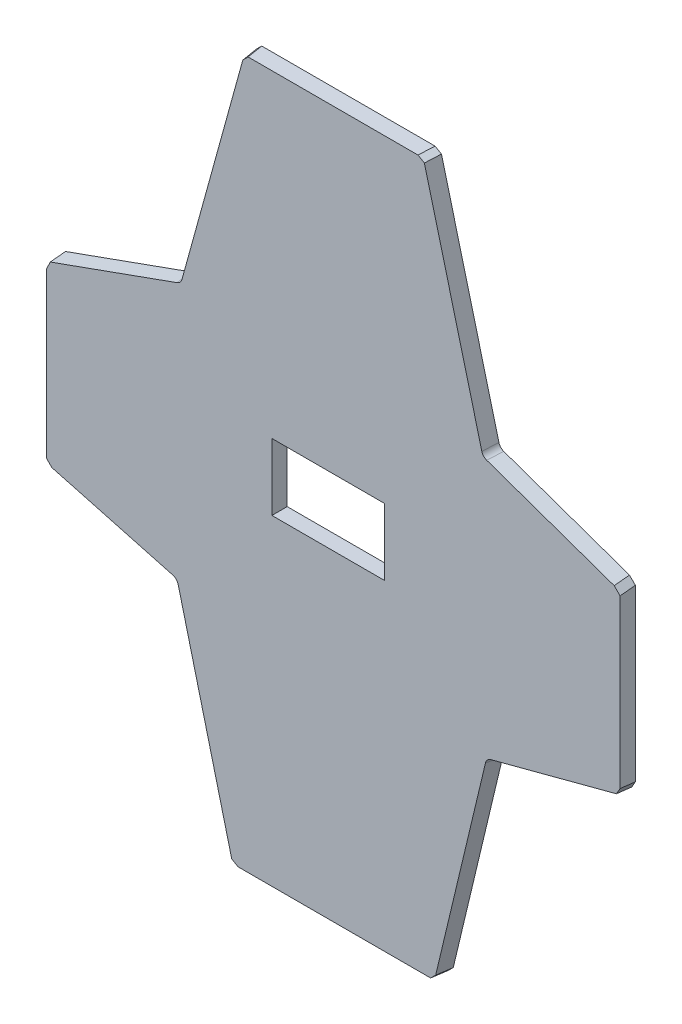
ISO-10303-21;
HEADER;
FILE_DESCRIPTION(('STEP AP214'),'2;1');
FILE_NAME('part.step','',(''),(''),'','','');
FILE_SCHEMA(('AUTOMOTIVE_DESIGN { 1 0 10303 214 1 1 1 1 }'));
ENDSEC;
DATA;
#1=APPLICATION_CONTEXT('core data for automotive mechanical design processes');
#2=APPLICATION_PROTOCOL_DEFINITION('international standard','automotive_design',2000,#1);
#3=PRODUCT_CONTEXT('',#1,'mechanical');
#4=PRODUCT('Part','Part','',(#3));
#5=PRODUCT_RELATED_PRODUCT_CATEGORY('part','',(#4));
#6=PRODUCT_DEFINITION_FORMATION('','',#4);
#7=PRODUCT_DEFINITION_CONTEXT('part definition',#1,'design');
#8=PRODUCT_DEFINITION('design','',#6,#7);
#9=PRODUCT_DEFINITION_SHAPE('','',#8);
#10=(LENGTH_UNIT() NAMED_UNIT(*) SI_UNIT(.MILLI.,.METRE.));
#11=(NAMED_UNIT(*) PLANE_ANGLE_UNIT() SI_UNIT($,.RADIAN.));
#12=(NAMED_UNIT(*) SI_UNIT($,.STERADIAN.) SOLID_ANGLE_UNIT());
#13=UNCERTAINTY_MEASURE_WITH_UNIT(LENGTH_MEASURE(1.E-05),#10,'distance_accuracy_value','');
#14=(GEOMETRIC_REPRESENTATION_CONTEXT(3) GLOBAL_UNCERTAINTY_ASSIGNED_CONTEXT((#13)) GLOBAL_UNIT_ASSIGNED_CONTEXT((#10,
#11,#12)) REPRESENTATION_CONTEXT('',''));
#15=CARTESIAN_POINT('',(0.,0.,0.));
#16=DIRECTION('',(0.,0.,1.));
#17=DIRECTION('',(1.,0.,0.));
#18=AXIS2_PLACEMENT_3D('',#15,#16,#17);
#19=CARTESIAN_POINT('',(-36.5402535478192,31.6416875138179,-36.));
#20=DIRECTION('',(0.,0.,1.));
#21=DIRECTION('',(1.,0.,0.));
#22=AXIS2_PLACEMENT_3D('',#19,#20,#21);
#23=PLANE('',#22);
#24=DIRECTION('',(0.266042791283463,0.96396121976255,0.));
#25=VECTOR('',#24,1.);
#26=CARTESIAN_POINT('',(-40.3843388760392,32.8659643599515,-36.));
#27=LINE('',#26,#25);
#28=CARTESIAN_POINT('',(-23.6840092023886,93.376794534998,-36.));
#29=VERTEX_POINT('',#28);
#30=CARTESIAN_POINT('',(-39.6006537185788,35.705515458671,-36.));
#31=VERTEX_POINT('',#30);
#32=EDGE_CURVE('E414',#29,#31,#27,.F.);
#33=ORIENTED_EDGE('',*,*,#32,.T.);
#34=CARTESIAN_POINT('',(-41.5421698604185,36.2470950169221,-36.));
#35=DIRECTION('',(0.,0.,1.));
#36=DIRECTION('',(0.902518135770878,-0.430651848486291,0.));
#37=AXIS2_PLACEMENT_3D('',#34,#35,#36);
#38=ELLIPSE('',#37,2.01612154459738,2.);
#39=CARTESIAN_POINT('',(-40.8485815374249,34.362458478107,-36.));
#40=VERTEX_POINT('',#39);
#41=EDGE_CURVE('E426',#31,#40,#38,.F.);
#42=ORIENTED_EDGE('',*,*,#41,.T.);
#43=DIRECTION('',(0.94120658805755,0.337831553584126,0.));
#44=VECTOR('',#43,1.);
#45=CARTESIAN_POINT('',(-74.5742274919446,22.2571592664243,-36.));
#46=LINE('',#45,#44);
#47=CARTESIAN_POINT('',(-74.0583025109049,22.4423425620887,-36.));
#48=VERTEX_POINT('',#47);
#49=EDGE_CURVE('E407',#40,#48,#46,.F.);
#50=ORIENTED_EDGE('',*,*,#49,.T.);
#51=DIRECTION('',(0.426365012162787,0.904551201648324,0.));
#52=VECTOR('',#51,1.);
#53=CARTESIAN_POINT('',(-78.2799950445426,13.4858453229724,-36.));
#54=LINE('',#53,#52);
#55=CARTESIAN_POINT('',(-75.,20.4444919621315,-36.));
#56=VERTEX_POINT('',#55);
#57=EDGE_CURVE('E391',#56,#48,#54,.T.);
#58=ORIENTED_EDGE('',*,*,#57,.F.);
#59=DIRECTION('',(0.,-1.,0.));
#60=VECTOR('',#59,1.);
#61=CARTESIAN_POINT('',(-75.,-15.,-36.));
#62=LINE('',#61,#60);
#63=CARTESIAN_POINT('',(-75.,-22.5363153576917,-36.));
#64=VERTEX_POINT('',#63);
#65=EDGE_CURVE('E406',#56,#64,#62,.T.);
#66=ORIENTED_EDGE('',*,*,#65,.T.);
#67=DIRECTION('',(-0.704762476360892,0.7094433394667,0.));
#68=VECTOR('',#67,1.);
#69=CARTESIAN_POINT('',(-78.5214099784737,-18.9915170198748,-36.));
#70=LINE('',#69,#68);
#71=CARTESIAN_POINT('',(-73.634658758092,-23.9107248682157,-36.));
#72=VERTEX_POINT('',#71);
#73=EDGE_CURVE('E394',#72,#64,#70,.T.);
#74=ORIENTED_EDGE('',*,*,#73,.F.);
#75=DIRECTION('',(-0.965584527186857,0.260089447800818,0.));
#76=VECTOR('',#75,1.);
#77=CARTESIAN_POINT('',(-32.493377225832,-34.9925233998452,-36.));
#78=LINE('',#77,#76);
#79=CARTESIAN_POINT('',(-42.002974198056,-32.4310223031779,-36.));
#80=VERTEX_POINT('',#79);
#81=EDGE_CURVE('E397',#72,#80,#78,.F.);
#82=ORIENTED_EDGE('',*,*,#81,.T.);
#83=CARTESIAN_POINT('',(-42.5479793065294,-34.3683334038556,-36.));
#84=DIRECTION('',(0.,0.,1.));
#85=DIRECTION('',(0.841020093323564,0.541003884113621,0.));
#86=AXIS2_PLACEMENT_3D('',#83,#84,#85);
#87=ELLIPSE('',#86,2.02249647616795,2.);
#88=CARTESIAN_POINT('',(-40.5932409731802,-33.8578810221488,-36.));
#89=VERTEX_POINT('',#88);
#90=EDGE_CURVE('E253',#80,#89,#87,.F.);
#91=ORIENTED_EDGE('',*,*,#90,.T.);
#92=DIRECTION('',(-0.246202748440187,0.969218348289227,0.));
#93=VECTOR('',#92,1.);
#94=CARTESIAN_POINT('',(-25.9416393245706,-91.5363644656716,-36.));
#95=LINE('',#94,#93);
#96=CARTESIAN_POINT('',(-26.5782707306176,-89.0301583256217,-36.));
#97=VERTEX_POINT('',#96);
#98=EDGE_CURVE('E248',#89,#97,#95,.F.);
#99=ORIENTED_EDGE('',*,*,#98,.T.);
#100=DIRECTION('',(-0.860536730968405,0.509388392736045,0.));
#101=VECTOR('',#100,1.);
#102=CARTESIAN_POINT('',(-15.1391820554169,-95.8014427867373,-36.));
#103=LINE('',#102,#101);
#104=CARTESIAN_POINT('',(-24.9398659378746,-90.,-36.));
#105=VERTEX_POINT('',#104);
#106=EDGE_CURVE('E396',#105,#97,#103,.T.);
#107=ORIENTED_EDGE('',*,*,#106,.F.);
#108=DIRECTION('',(1.,0.,0.));
#109=VECTOR('',#108,1.);
#110=CARTESIAN_POINT('',(15.,-90.,-36.));
#111=LINE('',#110,#109);
#112=CARTESIAN_POINT('',(25.4397337159729,-90.,-36.));
#113=VERTEX_POINT('',#112);
#114=EDGE_CURVE('E418',#105,#113,#111,.T.);
#115=ORIENTED_EDGE('',*,*,#114,.T.);
#116=DIRECTION('',(-0.710962910168323,-0.703229507604017,0.));
#117=VECTOR('',#116,1.);
#118=CARTESIAN_POINT('',(20.4631774215762,-94.9224244787168,-36.));
#119=LINE('',#118,#117);
#120=CARTESIAN_POINT('',(26.7632939212635,-88.6908366412104,-36.));
#121=VERTEX_POINT('',#120);
#122=EDGE_CURVE('E249',#121,#113,#119,.T.);
#123=ORIENTED_EDGE('',*,*,#122,.F.);
#124=DIRECTION('',(-0.232223509792915,-0.972662449927754,0.));
#125=VECTOR('',#124,1.);
#126=CARTESIAN_POINT('',(41.1041337500767,-28.6245823056621,-36.));
#127=LINE('',#126,#125);
#128=CARTESIAN_POINT('',(39.795840619288,-34.104335854092,-36.));
#129=VERTEX_POINT('',#128);
#130=EDGE_CURVE('E235',#121,#129,#127,.F.);
#131=ORIENTED_EDGE('',*,*,#130,.T.);
#132=CARTESIAN_POINT('',(41.7579711394341,-34.5880220555358,-36.));
#133=DIRECTION('',(0.,0.,1.));
#134=DIRECTION('',(-0.837657940995873,0.546195179296335,0.));
#135=AXIS2_PLACEMENT_3D('',#132,#133,#134);
#136=ELLIPSE('',#135,2.02346057407456,2.);
#137=CARTESIAN_POINT('',(41.2212929928244,-32.6477918162582,-36.));
#138=VERTEX_POINT('',#137);
#139=EDGE_CURVE('E250',#129,#138,#136,.F.);
#140=ORIENTED_EDGE('',*,*,#139,.T.);
#141=DIRECTION('',(-0.966833104440869,-0.255408982138907,0.));
#142=VECTOR('',#141,1.);
#143=CARTESIAN_POINT('',(74.3866081874635,-23.8864871430204,-36.));
#144=LINE('',#143,#142);
#145=CARTESIAN_POINT('',(74.0327342795837,-23.9799702624978,-36.));
#146=VERTEX_POINT('',#145);
#147=EDGE_CURVE('E252',#138,#146,#144,.F.);
#148=ORIENTED_EDGE('',*,*,#147,.T.);
#149=DIRECTION('',(-0.501926972034819,-0.864910003840837,0.));
#150=VECTOR('',#149,1.);
#151=CARTESIAN_POINT('',(79.5633827357512,-14.4496731396439,-36.));
#152=LINE('',#151,#150);
#153=CARTESIAN_POINT('',(75.,-22.3131983124493,-36.));
#154=VERTEX_POINT('',#153);
#155=EDGE_CURVE('E389',#154,#146,#152,.T.);
#156=ORIENTED_EDGE('',*,*,#155,.F.);
#157=DIRECTION('',(0.,1.,0.));
#158=VECTOR('',#157,1.);
#159=CARTESIAN_POINT('',(75.,15.,-36.));
#160=LINE('',#159,#158);
#161=CARTESIAN_POINT('',(75.,21.3394243131476,-36.));
#162=VERTEX_POINT('',#161);
#163=EDGE_CURVE('E425',#154,#162,#160,.T.);
#164=ORIENTED_EDGE('',*,*,#163,.T.);
#165=DIRECTION('',(0.705371914071374,-0.708837402257588,0.));
#166=VECTOR('',#165,1.);
#167=CARTESIAN_POINT('',(77.6521292861005,18.6742651310079,-36.));
#168=LINE('',#167,#166);
#169=CARTESIAN_POINT('',(73.4608455350852,22.8861406351601,-36.));
#170=VERTEX_POINT('',#169);
#171=EDGE_CURVE('E384',#170,#162,#168,.T.);
#172=ORIENTED_EDGE('',*,*,#171,.F.);
#173=DIRECTION('',(0.943264607804052,-0.332041984791484,0.));
#174=VECTOR('',#173,1.);
#175=CARTESIAN_POINT('',(31.6779838024015,37.5942768518753,-36.));
#176=LINE('',#175,#174);
#177=CARTESIAN_POINT('',(40.1050450980807,34.6278365387049,-36.));
#178=VERTEX_POINT('',#177);
#179=EDGE_CURVE('E424',#170,#178,#176,.F.);
#180=ORIENTED_EDGE('',*,*,#179,.T.);
#181=CARTESIAN_POINT('',(40.7881302682312,36.5169480795651,-36.));
#182=DIRECTION('',(0.,0.,1.));
#183=DIRECTION('',(-0.896885715655142,-0.442262380328425,0.));
#184=AXIS2_PLACEMENT_3D('',#181,#182,#183);
#185=ELLIPSE('',#184,2.01707177083657,2.);
#186=CARTESIAN_POINT('',(38.8382898644863,36.0032008340004,-36.));
#187=VERTEX_POINT('',#186);
#188=EDGE_CURVE('E256',#178,#187,#185,.F.);
#189=ORIENTED_EDGE('',*,*,#188,.T.);
#190=DIRECTION('',(0.251551335305415,-0.967843957312367,0.));
#191=VECTOR('',#190,1.);
#192=CARTESIAN_POINT('',(24.7499132754801,90.2082406659524,-36.));
#193=LINE('',#192,#191);
#194=CARTESIAN_POINT('',(23.8153141315703,93.8041115956142,-36.));
#195=VERTEX_POINT('',#194);
#196=EDGE_CURVE('E420',#187,#195,#193,.F.);
#197=ORIENTED_EDGE('',*,*,#196,.T.);
#198=DIRECTION('',(-0.865228886840942,0.501377077034824,0.));
#199=VECTOR('',#198,1.);
#200=CARTESIAN_POINT('',(17.9798531385479,97.1856056954179,-36.));
#201=LINE('',#200,#199);
#202=CARTESIAN_POINT('',(22.1441897787212,94.7724836138583,-36.));
#203=VERTEX_POINT('',#202);
#204=EDGE_CURVE('E386',#203,#195,#201,.F.);
#205=ORIENTED_EDGE('',*,*,#204,.F.);
#206=DIRECTION('',(1.,0.,0.));
#207=VECTOR('',#206,1.);
#208=CARTESIAN_POINT('',(40.,94.7724836138583,-36.));
#209=LINE('',#208,#207);
#210=CARTESIAN_POINT('',(-22.2925713826402,94.7724836138583,-36.));
#211=VERTEX_POINT('',#210);
#212=EDGE_CURVE('E415',#203,#211,#209,.F.);
#213=ORIENTED_EDGE('',*,*,#212,.T.);
#214=DIRECTION('',(-0.706027396077023,-0.708184521144524,0.));
#215=VECTOR('',#214,1.);
#216=CARTESIAN_POINT('',(-21.6044927614201,95.4626645212652,-36.));
#217=LINE('',#216,#215);
#218=EDGE_CURVE('E393',#29,#211,#217,.F.);
#219=ORIENTED_EDGE('',*,*,#218,.F.);
#220=EDGE_LOOP('',(#33,#42,#50,#58,#66,#74,#82,#91,#99,#107,#115,#123,#131,#140,#148,#156,#164,
#172,#180,#189,#197,#205,#213,#219));
#221=FACE_BOUND('',#220,.T.);
#222=DIRECTION('',(1.,0.,0.));
#223=VECTOR('',#222,1.);
#224=CARTESIAN_POINT('',(13.3265107487808,11.4688759171328,-36.));
#225=LINE('',#224,#223);
#226=CARTESIAN_POINT('',(-16.0725796303478,11.4688759171328,-36.));
#227=VERTEX_POINT('',#226);
#228=CARTESIAN_POINT('',(13.3265107487808,11.4688759171328,-36.));
#229=VERTEX_POINT('',#228);
#230=EDGE_CURVE('E363',#227,#229,#225,.T.);
#231=ORIENTED_EDGE('',*,*,#230,.T.);
#232=DIRECTION('',(0.,-1.,0.));
#233=VECTOR('',#232,1.);
#234=CARTESIAN_POINT('',(13.3265107487808,11.4688759171328,-36.));
#235=LINE('',#234,#233);
#236=CARTESIAN_POINT('',(13.3265107487808,-5.97673815399842,-36.));
#237=VERTEX_POINT('',#236);
#238=EDGE_CURVE('E11',#229,#237,#235,.T.);
#239=ORIENTED_EDGE('',*,*,#238,.T.);
#240=DIRECTION('',(-1.,0.,0.));
#241=VECTOR('',#240,1.);
#242=CARTESIAN_POINT('',(13.3265107487808,-5.97673815399842,-36.));
#243=LINE('',#242,#241);
#244=CARTESIAN_POINT('',(-16.0725796303478,-5.97673815399842,-36.));
#245=VERTEX_POINT('',#244);
#246=EDGE_CURVE('E366',#237,#245,#243,.T.);
#247=ORIENTED_EDGE('',*,*,#246,.T.);
#248=DIRECTION('',(0.,1.,0.));
#249=VECTOR('',#248,1.);
#250=CARTESIAN_POINT('',(-16.0725796303478,11.4688759171328,-36.));
#251=LINE('',#250,#249);
#252=EDGE_CURVE('E368',#245,#227,#251,.T.);
#253=ORIENTED_EDGE('',*,*,#252,.T.);
#254=EDGE_LOOP('',(#231,#239,#247,#253));
#255=FACE_BOUND('',#254,.T.);
#256=ADVANCED_FACE('F37',(#221,#255),#23,.T.);
#257=CARTESIAN_POINT('',(13.3265107487808,11.4688759171328,50.001));
#258=DIRECTION('',(0.,1.,0.));
#259=DIRECTION('',(0.,0.,1.));
#260=AXIS2_PLACEMENT_3D('',#257,#258,#259);
#261=PLANE('',#260);
#262=DIRECTION('',(0.,0.,-1.));
#263=VECTOR('',#262,1.);
#264=CARTESIAN_POINT('',(-16.0725796303478,11.4688759171328,50.001));
#265=LINE('',#264,#263);
#266=CARTESIAN_POINT('',(-16.0725796303478,11.4688759171328,-40.));
#267=VERTEX_POINT('',#266);
#268=EDGE_CURVE('E64',#227,#267,#265,.T.);
#269=ORIENTED_EDGE('',*,*,#268,.T.);
#270=DIRECTION('',(1.,0.,0.));
#271=VECTOR('',#270,1.);
#272=CARTESIAN_POINT('',(13.3265107487808,11.4688759171328,-40.));
#273=LINE('',#272,#271);
#274=CARTESIAN_POINT('',(13.3265107487808,11.4688759171328,-40.));
#275=VERTEX_POINT('',#274);
#276=EDGE_CURVE('E356',#267,#275,#273,.T.);
#277=ORIENTED_EDGE('',*,*,#276,.T.);
#278=DIRECTION('',(0.,0.,-1.));
#279=VECTOR('',#278,1.);
#280=CARTESIAN_POINT('',(13.3265107487808,11.4688759171328,50.001));
#281=LINE('',#280,#279);
#282=EDGE_CURVE('E59',#229,#275,#281,.T.);
#283=ORIENTED_EDGE('',*,*,#282,.F.);
#284=ORIENTED_EDGE('',*,*,#230,.F.);
#285=EDGE_LOOP('',(#269,#277,#283,#284));
#286=FACE_BOUND('',#285,.T.);
#287=ADVANCED_FACE('F547',(#286),#261,.F.);
#288=CARTESIAN_POINT('',(-16.0725796303478,11.4688759171328,50.001));
#289=DIRECTION('',(-1.,0.,0.));
#290=DIRECTION('',(0.,0.,1.));
#291=AXIS2_PLACEMENT_3D('',#288,#289,#290);
#292=PLANE('',#291);
#293=DIRECTION('',(0.,0.,-1.));
#294=VECTOR('',#293,1.);
#295=CARTESIAN_POINT('',(-16.0725796303478,-5.97673815399842,50.001));
#296=LINE('',#295,#294);
#297=CARTESIAN_POINT('',(-16.0725796303478,-5.97673815399842,-40.));
#298=VERTEX_POINT('',#297);
#299=EDGE_CURVE('E362',#245,#298,#296,.T.);
#300=ORIENTED_EDGE('',*,*,#299,.T.);
#301=DIRECTION('',(0.,1.,0.));
#302=VECTOR('',#301,1.);
#303=CARTESIAN_POINT('',(-16.0725796303478,11.4688759171328,-40.));
#304=LINE('',#303,#302);
#305=EDGE_CURVE('E377',#298,#267,#304,.T.);
#306=ORIENTED_EDGE('',*,*,#305,.T.);
#307=ORIENTED_EDGE('',*,*,#268,.F.);
#308=ORIENTED_EDGE('',*,*,#252,.F.);
#309=EDGE_LOOP('',(#300,#306,#307,#308));
#310=FACE_BOUND('',#309,.T.);
#311=ADVANCED_FACE('F549',(#310),#292,.F.);
#312=CARTESIAN_POINT('',(15.,-90.,50.));
#313=DIRECTION('',(0.,1.,0.));
#314=DIRECTION('',(0.,0.,1.));
#315=AXIS2_PLACEMENT_3D('',#312,#313,#314);
#316=PLANE('',#315);
#317=ORIENTED_EDGE('',*,*,#114,.F.);
#318=DIRECTION('',(-0.145599384766746,0.,-0.989343630472014));
#319=VECTOR('',#318,1.);
#320=CARTESIAN_POINT('',(-11.7050606398666,-90.,53.9301212233692));
#321=LINE('',#320,#319);
#322=CARTESIAN_POINT('',(-25.528536568714,-90.,-40.));
#323=VERTEX_POINT('',#322);
#324=EDGE_CURVE('E315',#105,#323,#321,.T.);
#325=ORIENTED_EDGE('',*,*,#324,.T.);
#326=DIRECTION('',(1.,0.,0.));
#327=VECTOR('',#326,1.);
#328=CARTESIAN_POINT('',(15.,-90.,-40.));
#329=LINE('',#328,#327);
#330=CARTESIAN_POINT('',(26.0345768691385,-90.,-40.));
#331=VERTEX_POINT('',#330);
#332=EDGE_CURVE('E340',#323,#331,#329,.T.);
#333=ORIENTED_EDGE('',*,*,#332,.T.);
#334=DIRECTION('',(-0.14709320687462,0.,0.989122635718817));
#335=VECTOR('',#334,1.);
#336=CARTESIAN_POINT('',(12.7014383799597,-90.,49.6581790895474));
#337=LINE('',#336,#335);
#338=EDGE_CURVE('E44',#331,#113,#337,.T.);
#339=ORIENTED_EDGE('',*,*,#338,.T.);
#340=EDGE_LOOP('',(#317,#325,#333,#339));
#341=FACE_BOUND('',#340,.T.);
#342=ADVANCED_FACE('F508',(#341),#316,.F.);
#343=CARTESIAN_POINT('',(75.,15.,50.));
#344=DIRECTION('',(-1.,0.,0.));
#345=DIRECTION('',(0.,0.,1.));
#346=AXIS2_PLACEMENT_3D('',#343,#344,#345);
#347=PLANE('',#346);
#348=ORIENTED_EDGE('',*,*,#163,.F.);
#349=DIRECTION('',(0.,-0.117086990613549,-0.993121662551504));
#350=VECTOR('',#349,1.);
#351=CARTESIAN_POINT('',(75.,-11.8014382150619,53.1598341502835));
#352=LINE('',#351,#350);
#353=CARTESIAN_POINT('',(75.,-22.784790041957,-40.));
#354=VERTEX_POINT('',#353);
#355=EDGE_CURVE('E285',#154,#354,#352,.T.);
#356=ORIENTED_EDGE('',*,*,#355,.T.);
#357=DIRECTION('',(0.,1.,0.));
#358=VECTOR('',#357,1.);
#359=CARTESIAN_POINT('',(75.,15.,-40.));
#360=LINE('',#359,#358);
#361=CARTESIAN_POINT('',(75.,21.736415518955,-40.));
#362=VERTEX_POINT('',#361);
#363=EDGE_CURVE('E343',#354,#362,#360,.T.);
#364=ORIENTED_EDGE('',*,*,#363,.T.);
#365=DIRECTION('',(0.,-0.0987625814531095,0.995111025215136));
#366=VECTOR('',#365,1.);
#367=CARTESIAN_POINT('',(75.,12.8255321705925,49.7841888486035));
#368=LINE('',#367,#366);
#369=EDGE_CURVE('E281',#362,#162,#368,.T.);
#370=ORIENTED_EDGE('',*,*,#369,.T.);
#371=EDGE_LOOP('',(#348,#356,#364,#370));
#372=FACE_BOUND('',#371,.T.);
#373=ADVANCED_FACE('F530',(#372),#347,.F.);
#374=CARTESIAN_POINT('',(-72.2932330827068,15.9022556390977,38.7218045112782));
#375=DIRECTION('',(-0.336460754073962,0.937387508648936,0.0899934419661856));
#376=DIRECTION('',(-0.202310403375224,-0.165286709153897,0.965272399099461));
#377=AXIS2_PLACEMENT_3D('',#374,#375,#376);
#378=PLANE('',#377);
#379=ORIENTED_EDGE('',*,*,#49,.F.);
#380=DIRECTION('',(0.113905835910506,-0.0543521031257024,0.992003684182343));
#381=VECTOR('',#380,1.);
#382=CARTESIAN_POINT('',(-41.2974077924333,34.5766235443895,-39.9088190255318));
#383=LINE('',#382,#381);
#384=CARTESIAN_POINT('',(-41.307877557094,34.5816193703188,-40.));
#385=VERTEX_POINT('',#384);
#386=EDGE_CURVE('E274',#40,#385,#383,.F.);
#387=ORIENTED_EDGE('',*,*,#386,.T.);
#388=DIRECTION('',(0.94120658805755,0.337831553584126,0.));
#389=VECTOR('',#388,1.);
#390=CARTESIAN_POINT('',(-74.6963334514651,22.5973493177161,-40.));
#391=LINE('',#390,#389);
#392=CARTESIAN_POINT('',(-74.0583025109049,22.8263606597733,-40.));
#393=VERTEX_POINT('',#392);
#394=EDGE_CURVE('E347',#385,#393,#391,.F.);
#395=ORIENTED_EDGE('',*,*,#394,.T.);
#396=DIRECTION('',(0.,0.0955651289382371,-0.995423179422209));
#397=VECTOR('',#396,1.);
#398=CARTESIAN_POINT('',(-74.0583025109049,15.2744972229942,38.6615368630888));
#399=LINE('',#398,#397);
#400=EDGE_CURVE('E299',#393,#48,#399,.F.);
#401=ORIENTED_EDGE('',*,*,#400,.T.);
#402=EDGE_LOOP('',(#379,#387,#395,#401));
#403=FACE_BOUND('',#402,.T.);
#404=ADVANCED_FACE('F472',(#403),#378,.T.);
#405=CARTESIAN_POINT('',(15.5118296389287,87.80717977501,38.438564044998));
#406=DIRECTION('',(0.959984059924965,0.249508477396114,0.127185393805478));
#407=DIRECTION('',(-0.169271090814824,0.15514646615907,0.973281496717528));
#408=AXIS2_PLACEMENT_3D('',#405,#406,#407);
#409=PLANE('',#408);
#410=ORIENTED_EDGE('',*,*,#196,.F.);
#411=DIRECTION('',(-0.11644204860875,-0.0574186172096706,0.991536359249386));
#412=VECTOR('',#411,1.);
#413=CARTESIAN_POINT('',(39.3047990221417,36.2332406784403,-39.9724549444529));
#414=LINE('',#413,#412);
#415=CARTESIAN_POINT('',(39.3080338028605,36.2348357777886,-40.));
#416=VERTEX_POINT('',#415);
#417=EDGE_CURVE('E269',#187,#416,#414,.F.);
#418=ORIENTED_EDGE('',*,*,#417,.T.);
#419=DIRECTION('',(0.251551335305415,-0.967843957312367,0.));
#420=VECTOR('',#419,1.);
#421=CARTESIAN_POINT('',(25.2463271305871,90.337263084466,-40.));
#422=LINE('',#421,#420);
#423=CARTESIAN_POINT('',(24.2782128098669,94.0620836828498,-40.));
#424=VERTEX_POINT('',#423);
#425=EDGE_CURVE('E334',#416,#424,#422,.F.);
#426=ORIENTED_EDGE('',*,*,#425,.T.);
#427=DIRECTION('',(0.114722272058951,0.0639343885887995,-0.991338082719215));
#428=VECTOR('',#427,1.);
#429=CARTESIAN_POINT('',(15.1962541371745,89.0007345262627,38.4790201269344));
#430=LINE('',#429,#428);
#431=EDGE_CURVE('E290',#424,#195,#430,.F.);
#432=ORIENTED_EDGE('',*,*,#431,.T.);
#433=EDGE_LOOP('',(#410,#418,#426,#432));
#434=FACE_BOUND('',#433,.T.);
#435=ADVANCED_FACE('F439',(#434),#409,.T.);
#436=CARTESIAN_POINT('',(-15.2739026468548,-88.8265250426709,41.1643415881129));
#437=DIRECTION('',(-0.959506683112513,-0.243735772177657,0.141208351110636));
#438=DIRECTION('',(0.169186916402824,-0.0978558235286909,0.980714038402442));
#439=AXIS2_PLACEMENT_3D('',#436,#437,#438);
#440=PLANE('',#439);
#441=ORIENTED_EDGE('',*,*,#98,.F.);
#442=DIRECTION('',(0.125090313918316,0.0804669784135172,0.98887687744674));
#443=VECTOR('',#442,1.);
#444=CARTESIAN_POINT('',(-39.7523943100578,-33.316988700664,-29.3528520586899));
#445=LINE('',#444,#443);
#446=CARTESIAN_POINT('',(-41.0992304113853,-34.1833693827272,-40.));
#447=VERTEX_POINT('',#446);
#448=EDGE_CURVE('E262',#89,#447,#445,.F.);
#449=ORIENTED_EDGE('',*,*,#448,.T.);
#450=DIRECTION('',(-0.246202748440187,0.969218348289227,0.));
#451=VECTOR('',#450,1.);
#452=CARTESIAN_POINT('',(-26.4946272181061,-91.6768355364916,-40.));
#453=LINE('',#452,#451);
#454=CARTESIAN_POINT('',(-27.1669413614571,-89.0301583256217,-40.));
#455=VERTEX_POINT('',#454);
#456=EDGE_CURVE('E339',#447,#455,#453,.F.);
#457=ORIENTED_EDGE('',*,*,#456,.T.);
#458=DIRECTION('',(-0.145599384766746,0.,-0.989343630472014));
#459=VECTOR('',#458,1.);
#460=CARTESIAN_POINT('',(-15.2232718973194,-89.0301583256217,41.1568903792957));
#461=LINE('',#460,#459);
#462=EDGE_CURVE('E309',#455,#97,#461,.F.);
#463=ORIENTED_EDGE('',*,*,#462,.T.);
#464=EDGE_LOOP('',(#441,#449,#457,#463));
#465=FACE_BOUND('',#464,.T.);
#466=ADVANCED_FACE('F503',(#465),#440,.T.);
#467=CARTESIAN_POINT('',(72.2110280321725,-15.6509783606551,38.7276321698281));
#468=DIRECTION('',(0.253765691352181,-0.960612540388958,0.113254232327197));
#469=DIRECTION('',(0.211594669680946,0.169381908877474,0.962568161071014));
#470=AXIS2_PLACEMENT_3D('',#467,#468,#469);
#471=PLANE('',#470);
#472=ORIENTED_EDGE('',*,*,#147,.F.);
#473=DIRECTION('',(-0.127186540806258,0.082932032348628,0.988405717227629));
#474=VECTOR('',#473,1.);
#475=CARTESIAN_POINT('',(37.2121579029228,-30.0336337547365,-4.84377844639336));
#476=LINE('',#475,#474);
#477=CARTESIAN_POINT('',(41.7360068945732,-32.9834112118288,-40.));
#478=VERTEX_POINT('',#477);
#479=EDGE_CURVE('E236',#138,#478,#476,.F.);
#480=ORIENTED_EDGE('',*,*,#479,.T.);
#481=DIRECTION('',(-0.966833104440869,-0.255408982138907,0.));
#482=VECTOR('',#481,1.);
#483=CARTESIAN_POINT('',(74.503062039519,-24.3273151764123,-40.));
#484=LINE('',#483,#482);
#485=CARTESIAN_POINT('',(74.0327342795837,-24.4515619920054,-40.));
#486=VERTEX_POINT('',#485);
#487=EDGE_CURVE('E336',#478,#486,#484,.F.);
#488=ORIENTED_EDGE('',*,*,#487,.T.);
#489=DIRECTION('',(0.,-0.117086990613549,-0.993121662551504));
#490=VECTOR('',#489,1.);
#491=CARTESIAN_POINT('',(74.0327342795837,-15.176334451781,38.6716726343565));
#492=LINE('',#491,#490);
#493=EDGE_CURVE('E278',#486,#146,#492,.F.);
#494=ORIENTED_EDGE('',*,*,#493,.T.);
#495=EDGE_LOOP('',(#472,#480,#488,#494));
#496=FACE_BOUND('',#495,.T.);
#497=ADVANCED_FACE('F536',(#496),#471,.T.);
#498=CARTESIAN_POINT('',(0.,0.,-40.));
#499=DIRECTION('',(0.,0.,1.));
#500=DIRECTION('',(1.,0.,0.));
#501=AXIS2_PLACEMENT_3D('',#498,#499,#500);
#502=PLANE('',#501);
#503=DIRECTION('',(-1.,0.,0.));
#504=VECTOR('',#503,1.);
#505=CARTESIAN_POINT('',(13.3265107487808,-5.97673815399842,-40.));
#506=LINE('',#505,#504);
#507=CARTESIAN_POINT('',(13.3265107487808,-5.97673815399842,-40.));
#508=VERTEX_POINT('',#507);
#509=EDGE_CURVE('E378',#508,#298,#506,.T.);
#510=ORIENTED_EDGE('',*,*,#509,.F.);
#511=DIRECTION('',(0.,-1.,0.));
#512=VECTOR('',#511,1.);
#513=CARTESIAN_POINT('',(13.3265107487808,11.4688759171328,-40.));
#514=LINE('',#513,#512);
#515=EDGE_CURVE('E370',#275,#508,#514,.T.);
#516=ORIENTED_EDGE('',*,*,#515,.F.);
#517=ORIENTED_EDGE('',*,*,#276,.F.);
#518=ORIENTED_EDGE('',*,*,#305,.F.);
#519=EDGE_LOOP('',(#510,#516,#517,#518));
#520=FACE_BOUND('',#519,.T.);
#521=ORIENTED_EDGE('',*,*,#332,.F.);
#522=DIRECTION('',(-0.860536730968405,0.509388392736045,0.));
#523=VECTOR('',#522,1.);
#524=CARTESIAN_POINT('',(-15.2919282707598,-96.0594850403368,-40.));
#525=LINE('',#524,#523);
#526=EDGE_CURVE('E311',#323,#455,#525,.T.);
#527=ORIENTED_EDGE('',*,*,#526,.T.);
#528=ORIENTED_EDGE('',*,*,#456,.F.);
#529=CARTESIAN_POINT('',(-43.0539687447345,-34.693821764434,-40.));
#530=DIRECTION('',(0.,0.,1.));
#531=DIRECTION('',(0.841020093323564,0.541003884113621,0.));
#532=AXIS2_PLACEMENT_3D('',#529,#530,#531);
#533=ELLIPSE('',#532,2.02249647616795,2.);
#534=CARTESIAN_POINT('',(-42.5089636362611,-32.7565106637564,-40.));
#535=VERTEX_POINT('',#534);
#536=EDGE_CURVE('E238',#447,#535,#533,.T.);
#537=ORIENTED_EDGE('',*,*,#536,.T.);
#538=DIRECTION('',(-0.965584527186857,0.260089447800818,0.));
#539=VECTOR('',#538,1.);
#540=CARTESIAN_POINT('',(-32.6093482595916,-35.4230669560986,-40.));
#541=LINE('',#540,#539);
#542=CARTESIAN_POINT('',(-73.634658758092,-24.3725063340277,-40.));
#543=VERTEX_POINT('',#542);
#544=EDGE_CURVE('E342',#543,#535,#541,.F.);
#545=ORIENTED_EDGE('',*,*,#544,.F.);
#546=DIRECTION('',(-0.704762476360892,0.7094433394667,0.));
#547=VECTOR('',#546,1.);
#548=CARTESIAN_POINT('',(-78.7522956524531,-19.2208793245125,-40.));
#549=LINE('',#548,#547);
#550=CARTESIAN_POINT('',(-75.,-22.9980968235037,-40.));
#551=VERTEX_POINT('',#550);
#552=EDGE_CURVE('E491',#543,#551,#549,.T.);
#553=ORIENTED_EDGE('',*,*,#552,.T.);
#554=DIRECTION('',(0.,-1.,0.));
#555=VECTOR('',#554,1.);
#556=CARTESIAN_POINT('',(-75.,-15.,-40.));
#557=LINE('',#556,#555);
#558=CARTESIAN_POINT('',(-75.,20.8285100598161,-40.));
#559=VERTEX_POINT('',#558);
#560=EDGE_CURVE('E349',#559,#551,#557,.T.);
#561=ORIENTED_EDGE('',*,*,#560,.F.);
#562=DIRECTION('',(0.426365012162787,0.904551201648324,0.));
#563=VECTOR('',#562,1.);
#564=CARTESIAN_POINT('',(-78.4280989141499,13.5556548683595,-40.));
#565=LINE('',#564,#563);
#566=EDGE_CURVE('E479',#559,#393,#565,.T.);
#567=ORIENTED_EDGE('',*,*,#566,.T.);
#568=ORIENTED_EDGE('',*,*,#394,.F.);
#569=CARTESIAN_POINT('',(-42.0014658800876,36.4662559091339,-40.));
#570=DIRECTION('',(0.,0.,1.));
#571=DIRECTION('',(0.902518135770878,-0.430651848486291,0.));
#572=AXIS2_PLACEMENT_3D('',#569,#570,#571);
#573=ELLIPSE('',#572,2.01612154459738,2.);
#574=CARTESIAN_POINT('',(-40.0599497382479,35.9246763508828,-40.));
#575=VERTEX_POINT('',#574);
#576=EDGE_CURVE('E271',#385,#575,#573,.T.);
#577=ORIENTED_EDGE('',*,*,#576,.T.);
#578=DIRECTION('',(0.266042791283463,0.96396121976255,0.));
#579=VECTOR('',#578,1.);
#580=CARTESIAN_POINT('',(-40.8673313819015,32.9992650278562,-40.));
#581=LINE('',#580,#579);
#582=CARTESIAN_POINT('',(-24.1325937552005,93.6347666222336,-40.));
#583=VERTEX_POINT('',#582);
#584=EDGE_CURVE('E350',#583,#575,#581,.F.);
#585=ORIENTED_EDGE('',*,*,#584,.F.);
#586=DIRECTION('',(-0.706027396077023,-0.708184521144524,0.));
#587=VECTOR('',#586,1.);
#588=CARTESIAN_POINT('',(-21.9584547144381,95.8155483086654,-40.));
#589=LINE('',#588,#587);
#590=CARTESIAN_POINT('',(-22.741155935452,95.0304557010939,-40.));
#591=VERTEX_POINT('',#590);
#592=EDGE_CURVE('E456',#583,#591,#589,.F.);
#593=ORIENTED_EDGE('',*,*,#592,.T.);
#594=DIRECTION('',(1.,0.,0.));
#595=VECTOR('',#594,1.);
#596=CARTESIAN_POINT('',(40.,95.0304557010939,-40.));
#597=LINE('',#596,#595);
#598=CARTESIAN_POINT('',(22.6070884570178,95.0304557010939,-40.));
#599=VERTEX_POINT('',#598);
#600=EDGE_CURVE('E319',#599,#591,#597,.F.);
#601=ORIENTED_EDGE('',*,*,#600,.F.);
#602=DIRECTION('',(-0.865228886840942,0.501377077034824,0.));
#603=VECTOR('',#602,1.);
#604=CARTESIAN_POINT('',(18.2081259543571,97.5795372159546,-40.));
#605=LINE('',#604,#603);
#606=EDGE_CURVE('E326',#599,#424,#605,.F.);
#607=ORIENTED_EDGE('',*,*,#606,.T.);
#608=ORIENTED_EDGE('',*,*,#425,.F.);
#609=CARTESIAN_POINT('',(41.2578742066054,36.7485830233533,-40.));
#610=DIRECTION('',(0.,0.,1.));
#611=DIRECTION('',(-0.896885715655142,-0.442262380328425,0.));
#612=AXIS2_PLACEMENT_3D('',#609,#610,#611);
#613=ELLIPSE('',#612,2.01707177083657,2.);
#614=CARTESIAN_POINT('',(40.5747890364548,34.8594714824931,-40.));
#615=VERTEX_POINT('',#614);
#616=EDGE_CURVE('E270',#416,#615,#613,.T.);
#617=ORIENTED_EDGE('',*,*,#616,.T.);
#618=DIRECTION('',(0.943264607804052,-0.332041984791484,0.));
#619=VECTOR('',#618,1.);
#620=CARTESIAN_POINT('',(31.8023228186959,37.9474990310322,-40.));
#621=LINE('',#620,#619);
#622=CARTESIAN_POINT('',(73.4608455350852,23.2831318409675,-40.));
#623=VERTEX_POINT('',#622);
#624=EDGE_CURVE('E344',#623,#615,#621,.F.);
#625=ORIENTED_EDGE('',*,*,#624,.F.);
#626=DIRECTION('',(0.705371914071374,-0.708837402257588,0.));
#627=VECTOR('',#626,1.);
#628=CARTESIAN_POINT('',(77.8506225051498,18.8717879217143,-40.));
#629=LINE('',#628,#627);
#630=EDGE_CURVE('E313',#623,#362,#629,.T.);
#631=ORIENTED_EDGE('',*,*,#630,.T.);
#632=ORIENTED_EDGE('',*,*,#363,.F.);
#633=DIRECTION('',(-0.501926972034819,-0.864910003840837,0.));
#634=VECTOR('',#633,1.);
#635=CARTESIAN_POINT('',(79.7681109198822,-14.5684815672198,-40.));
#636=LINE('',#635,#634);
#637=EDGE_CURVE('E321',#354,#486,#636,.T.);
#638=ORIENTED_EDGE('',*,*,#637,.T.);
#639=ORIENTED_EDGE('',*,*,#487,.F.);
#640=CARTESIAN_POINT('',(42.2726850411829,-34.9236414511065,-40.));
#641=DIRECTION('',(0.,0.,1.));
#642=DIRECTION('',(-0.837657940995873,0.546195179296335,0.));
#643=AXIS2_PLACEMENT_3D('',#640,#641,#642);
#644=ELLIPSE('',#643,2.02346057407456,2.);
#645=CARTESIAN_POINT('',(40.3105545210368,-34.4399552496627,-40.));
#646=VERTEX_POINT('',#645);
#647=EDGE_CURVE('E387',#478,#646,#644,.T.);
#648=ORIENTED_EDGE('',*,*,#647,.T.);
#649=DIRECTION('',(-0.232223509792915,-0.972662449927754,0.));
#650=VECTOR('',#649,1.);
#651=CARTESIAN_POINT('',(41.6668983453327,-28.7589425552094,-40.));
#652=LINE('',#651,#650);
#653=CARTESIAN_POINT('',(27.3581370744292,-88.6908366412104,-40.));
#654=VERTEX_POINT('',#653);
#655=EDGE_CURVE('E234',#654,#646,#652,.F.);
#656=ORIENTED_EDGE('',*,*,#655,.F.);
#657=DIRECTION('',(-0.710962910168323,-0.703229507604017,0.));
#658=VECTOR('',#657,1.);
#659=CARTESIAN_POINT('',(20.7573462413554,-95.219828267849,-40.));
#660=LINE('',#659,#658);
#661=EDGE_CURVE('E493',#654,#331,#660,.T.);
#662=ORIENTED_EDGE('',*,*,#661,.T.);
#663=EDGE_LOOP('',(#521,#527,#528,#537,#545,#553,#561,#567,#568,#577,#585,#593,#601,#607,#608,
#617,#625,#631,#632,#638,#639,#648,#656,#662));
#664=FACE_BOUND('',#663,.T.);
#665=ADVANCED_FACE('F496',(#520,#664),#502,.F.);
#666=CARTESIAN_POINT('',(29.0046949520724,-25.7358369403961,50.));
#667=DIRECTION('',(0.962644218219395,-0.229831653368925,0.143155580535572));
#668=DIRECTION('',(-0.169740148495087,-0.100307494817646,0.980370689317196));
#669=AXIS2_PLACEMENT_3D('',#666,#667,#668);
#670=PLANE('',#669);
#671=ORIENTED_EDGE('',*,*,#130,.F.);
#672=DIRECTION('',(-0.14709320687462,0.,0.989122635718817));
#673=VECTOR('',#672,1.);
#674=CARTESIAN_POINT('',(14.2993728350285,-88.6908366412104,47.8131599558953));
#675=LINE('',#674,#673);
#676=EDGE_CURVE('E310',#121,#654,#675,.F.);
#677=ORIENTED_EDGE('',*,*,#676,.T.);
#678=ORIENTED_EDGE('',*,*,#655,.T.);
#679=DIRECTION('',(-0.127186540806258,0.082932032348628,0.988405717227629));
#680=VECTOR('',#679,1.);
#681=CARTESIAN_POINT('',(38.5568109243346,-33.2964260698381,-26.3711192509569));
#682=LINE('',#681,#680);
#683=EDGE_CURVE('E227',#646,#129,#682,.T.);
#684=ORIENTED_EDGE('',*,*,#683,.T.);
#685=EDGE_LOOP('',(#671,#677,#678,#684));
#686=FACE_BOUND('',#685,.T.);
#687=ADVANCED_FACE('F231',(#686),#670,.T.);
#688=CARTESIAN_POINT('',(32.6566946580536,-28.6535312612826,34.7288180906579));
#689=DIRECTION('',(-0.127186540806258,0.082932032348628,0.988405717227629));
#690=DIRECTION('',(0.991822341173745,0.,0.127626186766787));
#691=AXIS2_PLACEMENT_3D('',#688,#689,#690);
#692=CYLINDRICAL_SURFACE('',#691,2.);
#693=ORIENTED_EDGE('',*,*,#139,.F.);
#694=ORIENTED_EDGE('',*,*,#683,.F.);
#695=ORIENTED_EDGE('',*,*,#647,.F.);
#696=ORIENTED_EDGE('',*,*,#479,.F.);
#697=EDGE_LOOP('',(#693,#694,#695,#696));
#698=FACE_BOUND('',#697,.T.);
#699=ADVANCED_FACE('F255',(#698),#692,.F.);
#700=CARTESIAN_POINT('',(-30.,-25.7358369403961,50.));
#701=DIRECTION('',(-0.258488409254304,-0.959640656487699,0.110786067251428));
#702=DIRECTION('',(-0.216059031516033,0.169210539523565,0.961606098261912));
#703=AXIS2_PLACEMENT_3D('',#700,#701,#702);
#704=PLANE('',#703);
#705=ORIENTED_EDGE('',*,*,#81,.F.);
#706=DIRECTION('',(0.,0.114683665092932,0.993402062088081));
#707=VECTOR('',#706,1.);
#708=CARTESIAN_POINT('',(-73.634658758092,-14.137008280636,48.6609689749484));
#709=LINE('',#708,#707);
#710=EDGE_CURVE('E304',#72,#543,#709,.F.);
#711=ORIENTED_EDGE('',*,*,#710,.T.);
#712=ORIENTED_EDGE('',*,*,#544,.T.);
#713=DIRECTION('',(0.125090313918316,0.0804669784135172,0.98887687744674));
#714=VECTOR('',#713,1.);
#715=CARTESIAN_POINT('',(-31.1096582602829,-25.4236674492378,50.1149669559551));
#716=LINE('',#715,#714);
#717=EDGE_CURVE('E261',#535,#80,#716,.T.);
#718=ORIENTED_EDGE('',*,*,#717,.T.);
#719=EDGE_LOOP('',(#705,#711,#712,#718));
#720=FACE_BOUND('',#719,.T.);
#721=ADVANCED_FACE('F490',(#720),#704,.T.);
#722=CARTESIAN_POINT('',(-33.1242167169924,-28.3062996850694,38.4977019517753));
#723=DIRECTION('',(0.125090313918316,0.0804669784135172,0.98887687744674));
#724=DIRECTION('',(0.992093965290831,0.,-0.125497267036038));
#725=AXIS2_PLACEMENT_3D('',#722,#723,#724);
#726=CYLINDRICAL_SURFACE('',#725,2.);
#727=ORIENTED_EDGE('',*,*,#90,.F.);
#728=ORIENTED_EDGE('',*,*,#717,.F.);
#729=ORIENTED_EDGE('',*,*,#536,.F.);
#730=ORIENTED_EDGE('',*,*,#448,.F.);
#731=EDGE_LOOP('',(#727,#728,#729,#730));
#732=FACE_BOUND('',#731,.T.);
#733=ADVANCED_FACE('F499',(#732),#726,.F.);
#734=CARTESIAN_POINT('',(29.0046949520724,30.,50.));
#735=DIRECTION('',(0.33059644977078,0.939158133060421,0.0932093799218809));
#736=DIRECTION('',(0.198047334023453,-0.165598918010343,0.966102609374391));
#737=AXIS2_PLACEMENT_3D('',#734,#735,#736);
#738=PLANE('',#737);
#739=ORIENTED_EDGE('',*,*,#179,.F.);
#740=DIRECTION('',(0.,-0.0987625814531094,0.995111025215136));
#741=VECTOR('',#740,1.);
#742=CARTESIAN_POINT('',(73.4608455350852,14.5034724605675,48.4620037115731));
#743=LINE('',#742,#741);
#744=EDGE_CURVE('E280',#170,#623,#743,.F.);
#745=ORIENTED_EDGE('',*,*,#744,.T.);
#746=ORIENTED_EDGE('',*,*,#624,.T.);
#747=DIRECTION('',(-0.11644204860875,-0.0574186172096706,0.991536359249386));
#748=VECTOR('',#747,1.);
#749=CARTESIAN_POINT('',(29.994335629031,29.6421551318773,50.0954970833143));
#750=LINE('',#749,#748);
#751=EDGE_CURVE('E268',#615,#178,#750,.T.);
#752=ORIENTED_EDGE('',*,*,#751,.T.);
#753=EDGE_LOOP('',(#739,#745,#746,#752));
#754=FACE_BOUND('',#753,.T.);
#755=ADVANCED_FACE('F524',(#754),#738,.T.);
#756=CARTESIAN_POINT('',(32.1939207678793,32.2790663914947,37.1820789862418));
#757=DIRECTION('',(-0.11644204860875,-0.0574186172096706,0.991536359249386));
#758=DIRECTION('',(0.993174908884826,0.,0.116634473298494));
#759=AXIS2_PLACEMENT_3D('',#756,#757,#758);
#760=CYLINDRICAL_SURFACE('',#759,2.);
#761=ORIENTED_EDGE('',*,*,#188,.F.);
#762=ORIENTED_EDGE('',*,*,#751,.F.);
#763=ORIENTED_EDGE('',*,*,#616,.F.);
#764=ORIENTED_EDGE('',*,*,#417,.F.);
#765=EDGE_LOOP('',(#761,#762,#763,#764));
#766=FACE_BOUND('',#765,.T.);
#767=ADVANCED_FACE('F438',(#766),#760,.F.);
#768=CARTESIAN_POINT('',(-30.,30.,50.));
#769=DIRECTION('',(-0.956486466618421,0.263979840876486,0.124291121109404));
#770=DIRECTION('',(0.168654370747335,0.152594774329841,0.973791835083374));
#771=AXIS2_PLACEMENT_3D('',#768,#769,#770);
#772=PLANE('',#771);
#773=ORIENTED_EDGE('',*,*,#32,.F.);
#774=DIRECTION('',(0.111219310884432,-0.063960021783888,0.991735539597022));
#775=VECTOR('',#774,1.);
#776=CARTESIAN_POINT('',(-13.8254875091632,87.7073540642614,51.9078125310373));
#777=LINE('',#776,#775);
#778=EDGE_CURVE('E293',#29,#583,#777,.F.);
#779=ORIENTED_EDGE('',*,*,#778,.T.);
#780=ORIENTED_EDGE('',*,*,#584,.T.);
#781=DIRECTION('',(0.113905835910506,-0.0543521031257024,0.992003684182343));
#782=VECTOR('',#781,1.);
#783=CARTESIAN_POINT('',(-29.7231959247899,30.9923188051685,50.0225856161818));
#784=LINE('',#783,#782);
#785=EDGE_CURVE('E273',#575,#31,#784,.T.);
#786=ORIENTED_EDGE('',*,*,#785,.T.);
#787=EDGE_LOOP('',(#773,#779,#780,#786));
#788=FACE_BOUND('',#787,.T.);
#789=ADVANCED_FACE('F462',(#788),#772,.T.);
#790=CARTESIAN_POINT('',(-33.3720044368123,32.3485618986823,35.1538099502156));
#791=DIRECTION('',(0.113905835910506,-0.0543521031257024,0.992003684182343));
#792=DIRECTION('',(0.993472203048951,0.,-0.114074457128066));
#793=AXIS2_PLACEMENT_3D('',#790,#791,#792);
#794=CYLINDRICAL_SURFACE('',#793,2.);
#795=ORIENTED_EDGE('',*,*,#41,.F.);
#796=ORIENTED_EDGE('',*,*,#785,.F.);
#797=ORIENTED_EDGE('',*,*,#576,.F.);
#798=ORIENTED_EDGE('',*,*,#386,.F.);
#799=EDGE_LOOP('',(#795,#796,#797,#798));
#800=FACE_BOUND('',#799,.T.);
#801=ADVANCED_FACE('F463',(#800),#794,.F.);
#802=CARTESIAN_POINT('',(73.4608455350852,14.5034724605675,48.4620037115731));
#803=DIRECTION('',(0.707106781186551,0.703649753963116,0.069835691072982));
#804=DIRECTION('',(0.,-0.0987625814531094,0.995111025215135));
#805=AXIS2_PLACEMENT_3D('',#802,#803,#804);
#806=PLANE('',#805);
#807=ORIENTED_EDGE('',*,*,#744,.F.);
#808=ORIENTED_EDGE('',*,*,#171,.T.);
#809=ORIENTED_EDGE('',*,*,#369,.F.);
#810=ORIENTED_EDGE('',*,*,#630,.F.);
#811=EDGE_LOOP('',(#807,#808,#809,#810));
#812=FACE_BOUND('',#811,.T.);
#813=ADVANCED_FACE('F528',(#812),#806,.T.);
#814=CARTESIAN_POINT('',(75.,-11.8014382150619,53.1598341502835));
#815=DIRECTION('',(0.863399591303311,-0.501050445242301,0.0590728115106014));
#816=DIRECTION('',(0.,0.117086990613549,0.993121662551504));
#817=AXIS2_PLACEMENT_3D('',#814,#815,#816);
#818=PLANE('',#817);
#819=ORIENTED_EDGE('',*,*,#355,.F.);
#820=ORIENTED_EDGE('',*,*,#155,.T.);
#821=ORIENTED_EDGE('',*,*,#493,.F.);
#822=ORIENTED_EDGE('',*,*,#637,.F.);
#823=EDGE_LOOP('',(#819,#820,#821,#822));
#824=FACE_BOUND('',#823,.T.);
#825=ADVANCED_FACE('F534',(#824),#818,.T.);
#826=CARTESIAN_POINT('',(40.,90.,38.));
#827=DIRECTION('',(0.,0.997926790235507,0.0643593142463402));
#828=DIRECTION('',(0.,-0.0643593142463402,0.997926790235507));
#829=AXIS2_PLACEMENT_3D('',#826,#827,#828);
#830=PLANE('',#829);
#831=ORIENTED_EDGE('',*,*,#212,.F.);
#832=DIRECTION('',(-0.114722272058951,-0.0639343885887995,0.991338082719215));
#833=VECTOR('',#832,1.);
#834=CARTESIAN_POINT('',(13.9282757005296,90.1937785911983,34.9953556871237));
#835=LINE('',#834,#833);
#836=EDGE_CURVE('E291',#203,#599,#835,.F.);
#837=ORIENTED_EDGE('',*,*,#836,.T.);
#838=ORIENTED_EDGE('',*,*,#600,.T.);
#839=DIRECTION('',(-0.111219310884432,0.063960021783888,-0.991735539597022));
#840=VECTOR('',#839,1.);
#841=CARTESIAN_POINT('',(-13.3258686818178,89.6159105734968,43.9555191512239));
#842=LINE('',#841,#840);
#843=EDGE_CURVE('E289',#591,#211,#842,.F.);
#844=ORIENTED_EDGE('',*,*,#843,.T.);
#845=EDGE_LOOP('',(#831,#837,#838,#844));
#846=FACE_BOUND('',#845,.T.);
#847=ADVANCED_FACE('F449',(#846),#830,.T.);
#848=CARTESIAN_POINT('',(13.9282757005296,90.1937785911983,34.9953556871237));
#849=DIRECTION('',(-0.498160463649031,-0.859677961306719,-0.11309268455787));
#850=DIRECTION('',(0.114722272058951,0.0639343885887995,-0.991338082719215));
#851=AXIS2_PLACEMENT_3D('',#848,#849,#850);
#852=PLANE('',#851);
#853=ORIENTED_EDGE('',*,*,#836,.F.);
#854=ORIENTED_EDGE('',*,*,#204,.T.);
#855=ORIENTED_EDGE('',*,*,#431,.F.);
#856=ORIENTED_EDGE('',*,*,#606,.F.);
#857=EDGE_LOOP('',(#853,#854,#855,#856));
#858=FACE_BOUND('',#857,.T.);
#859=ADVANCED_FACE('F446',(#858),#852,.F.);
#860=CARTESIAN_POINT('',(-13.8254875091632,87.7073540642614,51.9078125310373));
#861=DIRECTION('',(0.702719810766134,-0.700579331167987,-0.123989791100014));
#862=DIRECTION('',(-0.111219310884432,0.063960021783888,-0.991735539597022));
#863=AXIS2_PLACEMENT_3D('',#860,#861,#862);
#864=PLANE('',#863);
#865=ORIENTED_EDGE('',*,*,#778,.F.);
#866=ORIENTED_EDGE('',*,*,#218,.T.);
#867=ORIENTED_EDGE('',*,*,#843,.F.);
#868=ORIENTED_EDGE('',*,*,#592,.F.);
#869=EDGE_LOOP('',(#865,#866,#867,#868));
#870=FACE_BOUND('',#869,.T.);
#871=ADVANCED_FACE('F454',(#870),#864,.F.);
#872=CARTESIAN_POINT('',(-75.,-15.,50.));
#873=DIRECTION('',(1.,0.,0.));
#874=DIRECTION('',(0.,0.,-1.));
#875=AXIS2_PLACEMENT_3D('',#872,#873,#874);
#876=PLANE('',#875);
#877=ORIENTED_EDGE('',*,*,#65,.F.);
#878=DIRECTION('',(0.,0.0955651289382371,-0.995423179422209));
#879=VECTOR('',#878,1.);
#880=CARTESIAN_POINT('',(-75.,11.9398022415947,52.5863429022046));
#881=LINE('',#880,#879);
#882=EDGE_CURVE('E301',#56,#559,#881,.T.);
#883=ORIENTED_EDGE('',*,*,#882,.T.);
#884=ORIENTED_EDGE('',*,*,#560,.T.);
#885=DIRECTION('',(0.,0.114683665092932,0.993402062088081));
#886=VECTOR('',#885,1.);
#887=CARTESIAN_POINT('',(-75.,-12.6394740652182,49.7274882184373));
#888=LINE('',#887,#886);
#889=EDGE_CURVE('E298',#551,#64,#888,.T.);
#890=ORIENTED_EDGE('',*,*,#889,.T.);
#891=EDGE_LOOP('',(#877,#883,#884,#890));
#892=FACE_BOUND('',#891,.T.);
#893=ADVANCED_FACE('F478',(#892),#876,.F.);
#894=CARTESIAN_POINT('',(-75.,11.9398022415947,52.5863429022046));
#895=DIRECTION('',(-0.903794361174313,0.426008271386456,0.040898721493941));
#896=DIRECTION('',(0.,-0.0955651289382371,0.995423179422208));
#897=AXIS2_PLACEMENT_3D('',#894,#895,#896);
#898=PLANE('',#897);
#899=ORIENTED_EDGE('',*,*,#882,.F.);
#900=ORIENTED_EDGE('',*,*,#57,.T.);
#901=ORIENTED_EDGE('',*,*,#400,.F.);
#902=ORIENTED_EDGE('',*,*,#566,.F.);
#903=EDGE_LOOP('',(#899,#900,#901,#902));
#904=FACE_BOUND('',#903,.T.);
#905=ADVANCED_FACE('F477',(#904),#898,.T.);
#906=CARTESIAN_POINT('',(-73.634658758092,-14.137008280636,48.6609689749484));
#907=DIRECTION('',(-0.707106781186539,-0.702441334547191,0.0810935972785405));
#908=DIRECTION('',(0.,0.114683665092932,0.993402062088081));
#909=AXIS2_PLACEMENT_3D('',#906,#907,#908);
#910=PLANE('',#909);
#911=ORIENTED_EDGE('',*,*,#710,.F.);
#912=ORIENTED_EDGE('',*,*,#73,.T.);
#913=ORIENTED_EDGE('',*,*,#889,.F.);
#914=ORIENTED_EDGE('',*,*,#552,.F.);
#915=EDGE_LOOP('',(#911,#912,#913,#914));
#916=FACE_BOUND('',#915,.T.);
#917=ADVANCED_FACE('F487',(#916),#910,.T.);
#918=CARTESIAN_POINT('',(14.2993728350285,-88.6908366412104,47.8131599558953));
#919=DIRECTION('',(0.699415323141889,-0.707106781186545,0.10401060404752));
#920=DIRECTION('',(-0.14709320687462,0.,0.989122635718817));
#921=AXIS2_PLACEMENT_3D('',#918,#919,#920);
#922=PLANE('',#921);
#923=ORIENTED_EDGE('',*,*,#676,.F.);
#924=ORIENTED_EDGE('',*,*,#122,.T.);
#925=ORIENTED_EDGE('',*,*,#338,.F.);
#926=ORIENTED_EDGE('',*,*,#661,.F.);
#927=EDGE_LOOP('',(#923,#924,#925,#926));
#928=FACE_BOUND('',#927,.T.);
#929=ADVANCED_FACE('F515',(#928),#922,.T.);
#930=CARTESIAN_POINT('',(-11.7050606398666,-90.,53.9301212233692));
#931=DIRECTION('',(-0.507963060533029,-0.858128841954799,0.0747557338217831));
#932=DIRECTION('',(0.145599384766746,0.,0.989343630472014));
#933=AXIS2_PLACEMENT_3D('',#930,#931,#932);
#934=PLANE('',#933);
#935=ORIENTED_EDGE('',*,*,#324,.F.);
#936=ORIENTED_EDGE('',*,*,#106,.T.);
#937=ORIENTED_EDGE('',*,*,#462,.F.);
#938=ORIENTED_EDGE('',*,*,#526,.F.);
#939=EDGE_LOOP('',(#935,#936,#937,#938));
#940=FACE_BOUND('',#939,.T.);
#941=ADVANCED_FACE('F43',(#940),#934,.T.);
#942=CARTESIAN_POINT('',(13.3265107487808,11.4688759171328,50.001));
#943=DIRECTION('',(1.,0.,0.));
#944=DIRECTION('',(0.,0.,-1.));
#945=AXIS2_PLACEMENT_3D('',#942,#943,#944);
#946=PLANE('',#945);
#947=ORIENTED_EDGE('',*,*,#282,.T.);
#948=ORIENTED_EDGE('',*,*,#515,.T.);
#949=DIRECTION('',(0.,0.,-1.));
#950=VECTOR('',#949,1.);
#951=CARTESIAN_POINT('',(13.3265107487808,-5.97673815399842,50.001));
#952=LINE('',#951,#950);
#953=EDGE_CURVE('E49',#237,#508,#952,.T.);
#954=ORIENTED_EDGE('',*,*,#953,.F.);
#955=ORIENTED_EDGE('',*,*,#238,.F.);
#956=EDGE_LOOP('',(#947,#948,#954,#955));
#957=FACE_BOUND('',#956,.T.);
#958=ADVANCED_FACE('F562',(#957),#946,.F.);
#959=CARTESIAN_POINT('',(13.3265107487808,-5.97673815399842,50.001));
#960=DIRECTION('',(0.,-1.,0.));
#961=DIRECTION('',(0.,0.,-1.));
#962=AXIS2_PLACEMENT_3D('',#959,#960,#961);
#963=PLANE('',#962);
#964=ORIENTED_EDGE('',*,*,#953,.T.);
#965=ORIENTED_EDGE('',*,*,#509,.T.);
#966=ORIENTED_EDGE('',*,*,#299,.F.);
#967=ORIENTED_EDGE('',*,*,#246,.F.);
#968=EDGE_LOOP('',(#964,#965,#966,#967));
#969=FACE_BOUND('',#968,.T.);
#970=ADVANCED_FACE('F557',(#969),#963,.F.);
#971=CLOSED_SHELL('',(#256,#287,#311,#342,#373,#404,#435,#466,#497,#665,#687,#699,#721,#733,
#755,#767,#789,#801,#813,#825,#847,#859,#871,#893,#905,#917,#929,#941,#958,#970));
#972=MANIFOLD_SOLID_BREP('B2',#971);
#973=ADVANCED_BREP_SHAPE_REPRESENTATION('',(#18,#972),#14);
#974=SHAPE_DEFINITION_REPRESENTATION(#9,#973);
ENDSEC;
END-ISO-10303-21;
